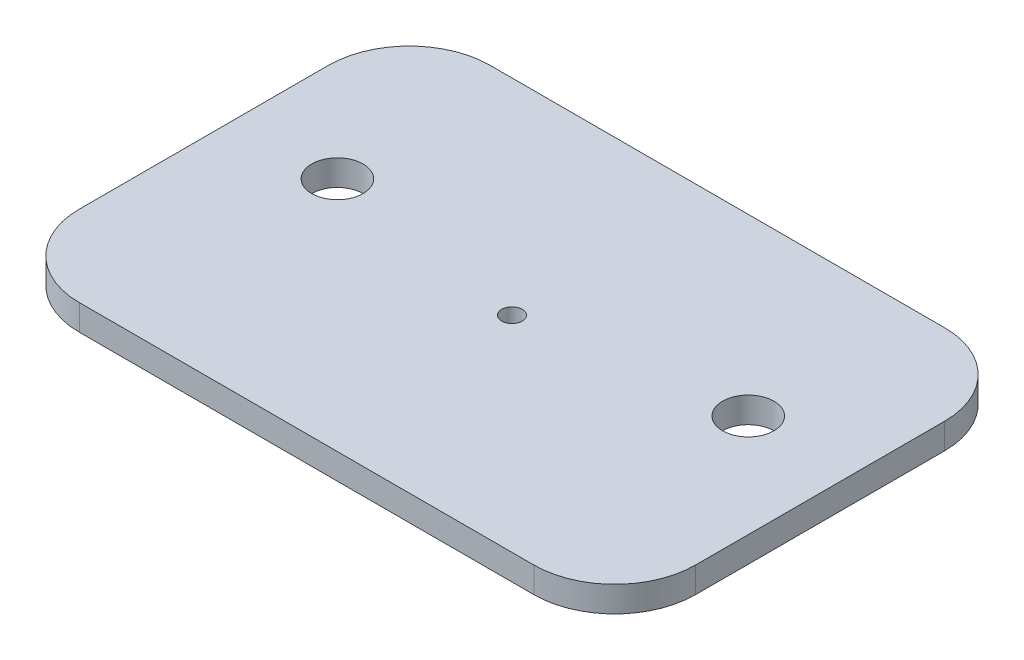
ISO-10303-21;
HEADER;
FILE_DESCRIPTION(('STEP AP214'),'2;1');
FILE_NAME('part.step','',(''),(''),'','','');
FILE_SCHEMA(('AUTOMOTIVE_DESIGN { 1 0 10303 214 1 1 1 1 }'));
ENDSEC;
DATA;
#1=APPLICATION_CONTEXT('core data for automotive mechanical design processes');
#2=APPLICATION_PROTOCOL_DEFINITION('international standard','automotive_design',2000,#1);
#3=PRODUCT_CONTEXT('',#1,'mechanical');
#4=PRODUCT('Part','Part','',(#3));
#5=PRODUCT_RELATED_PRODUCT_CATEGORY('part','',(#4));
#6=PRODUCT_DEFINITION_FORMATION('','',#4);
#7=PRODUCT_DEFINITION_CONTEXT('part definition',#1,'design');
#8=PRODUCT_DEFINITION('design','',#6,#7);
#9=PRODUCT_DEFINITION_SHAPE('','',#8);
#10=(LENGTH_UNIT() NAMED_UNIT(*) SI_UNIT(.MILLI.,.METRE.));
#11=(NAMED_UNIT(*) PLANE_ANGLE_UNIT() SI_UNIT($,.RADIAN.));
#12=(NAMED_UNIT(*) SI_UNIT($,.STERADIAN.) SOLID_ANGLE_UNIT());
#13=UNCERTAINTY_MEASURE_WITH_UNIT(LENGTH_MEASURE(1.E-05),#10,'distance_accuracy_value','');
#14=(GEOMETRIC_REPRESENTATION_CONTEXT(3) GLOBAL_UNCERTAINTY_ASSIGNED_CONTEXT((#13)) GLOBAL_UNIT_ASSIGNED_CONTEXT((#10,
#11,#12)) REPRESENTATION_CONTEXT('',''));
#15=CARTESIAN_POINT('',(0.,0.,0.));
#16=DIRECTION('',(0.,0.,1.));
#17=DIRECTION('',(1.,0.,0.));
#18=AXIS2_PLACEMENT_3D('',#15,#16,#17);
#19=CARTESIAN_POINT('',(0.,3.175,0.));
#20=DIRECTION('',(0.,-1.,0.));
#21=DIRECTION('',(0.,0.,-1.));
#22=AXIS2_PLACEMENT_3D('',#19,#20,#21);
#23=PLANE('',#22);
#24=DIRECTION('',(1.,0.,0.));
#25=VECTOR('',#24,1.);
#26=CARTESIAN_POINT('',(-38.1,3.175,25.4));
#27=LINE('',#26,#25);
#28=CARTESIAN_POINT('',(-28.1,3.175,25.4));
#29=VERTEX_POINT('',#28);
#30=CARTESIAN_POINT('',(28.1,3.175,25.4));
#31=VERTEX_POINT('',#30);
#32=EDGE_CURVE('E142',#29,#31,#27,.T.);
#33=ORIENTED_EDGE('',*,*,#32,.T.);
#34=CARTESIAN_POINT('',(28.1,3.175,15.4));
#35=DIRECTION('',(0.,-1.,0.));
#36=DIRECTION('',(0.,0.,-1.));
#37=AXIS2_PLACEMENT_3D('',#34,#35,#36);
#38=CIRCLE('',#37,10.);
#39=CARTESIAN_POINT('',(38.1,3.175,15.4));
#40=VERTEX_POINT('',#39);
#41=EDGE_CURVE('E161',#31,#40,#38,.F.);
#42=ORIENTED_EDGE('',*,*,#41,.T.);
#43=DIRECTION('',(0.,0.,-1.));
#44=VECTOR('',#43,1.);
#45=CARTESIAN_POINT('',(38.1,3.175,25.4));
#46=LINE('',#45,#44);
#47=CARTESIAN_POINT('',(38.1,3.175,-15.4));
#48=VERTEX_POINT('',#47);
#49=EDGE_CURVE('E125',#40,#48,#46,.T.);
#50=ORIENTED_EDGE('',*,*,#49,.T.);
#51=CARTESIAN_POINT('',(28.1,3.175,-15.4));
#52=DIRECTION('',(0.,-1.,0.));
#53=DIRECTION('',(0.,0.,-1.));
#54=AXIS2_PLACEMENT_3D('',#51,#52,#53);
#55=CIRCLE('',#54,10.);
#56=CARTESIAN_POINT('',(28.1,3.175,-25.4));
#57=VERTEX_POINT('',#56);
#58=EDGE_CURVE('E156',#48,#57,#55,.F.);
#59=ORIENTED_EDGE('',*,*,#58,.T.);
#60=DIRECTION('',(-1.,0.,0.));
#61=VECTOR('',#60,1.);
#62=CARTESIAN_POINT('',(-38.1,3.175,-25.4));
#63=LINE('',#62,#61);
#64=CARTESIAN_POINT('',(-28.1,3.175,-25.4));
#65=VERTEX_POINT('',#64);
#66=EDGE_CURVE('E172',#57,#65,#63,.T.);
#67=ORIENTED_EDGE('',*,*,#66,.T.);
#68=CARTESIAN_POINT('',(-28.1,3.175,-15.4));
#69=DIRECTION('',(0.,-1.,0.));
#70=DIRECTION('',(0.,0.,-1.));
#71=AXIS2_PLACEMENT_3D('',#68,#69,#70);
#72=CIRCLE('',#71,10.);
#73=CARTESIAN_POINT('',(-38.1,3.175,-15.4));
#74=VERTEX_POINT('',#73);
#75=EDGE_CURVE('E61',#65,#74,#72,.F.);
#76=ORIENTED_EDGE('',*,*,#75,.T.);
#77=DIRECTION('',(0.,0.,1.));
#78=VECTOR('',#77,1.);
#79=CARTESIAN_POINT('',(-38.1,3.175,25.4));
#80=LINE('',#79,#78);
#81=CARTESIAN_POINT('',(-38.1,3.175,15.4));
#82=VERTEX_POINT('',#81);
#83=EDGE_CURVE('E180',#74,#82,#80,.T.);
#84=ORIENTED_EDGE('',*,*,#83,.T.);
#85=CARTESIAN_POINT('',(-28.1,3.175,15.4));
#86=DIRECTION('',(0.,-1.,0.));
#87=DIRECTION('',(0.,0.,-1.));
#88=AXIS2_PLACEMENT_3D('',#85,#86,#87);
#89=CIRCLE('',#88,10.);
#90=EDGE_CURVE('E159',#82,#29,#89,.F.);
#91=ORIENTED_EDGE('',*,*,#90,.T.);
#92=EDGE_LOOP('',(#33,#42,#50,#59,#67,#76,#84,#91));
#93=FACE_BOUND('',#92,.T.);
#94=CARTESIAN_POINT('',(-25.4,3.175,-3.81));
#95=DIRECTION('',(0.,1.,0.));
#96=DIRECTION('',(0.,0.,1.));
#97=AXIS2_PLACEMENT_3D('',#94,#95,#96);
#98=CIRCLE('',#97,3.175);
#99=CARTESIAN_POINT('',(-25.4,3.175,-0.634999999999996));
#100=VERTEX_POINT('',#99);
#101=EDGE_CURVE('E133',#100,#100,#98,.T.);
#102=ORIENTED_EDGE('',*,*,#101,.F.);
#103=EDGE_LOOP('',(#102));
#104=FACE_BOUND('',#103,.T.);
#105=CARTESIAN_POINT('',(25.4,3.175,-3.81));
#106=DIRECTION('',(0.,1.,0.));
#107=DIRECTION('',(0.,0.,1.));
#108=AXIS2_PLACEMENT_3D('',#105,#106,#107);
#109=CIRCLE('',#108,3.175);
#110=CARTESIAN_POINT('',(25.4,3.175,-0.634999999999996));
#111=VERTEX_POINT('',#110);
#112=EDGE_CURVE('E187',#111,#111,#109,.T.);
#113=ORIENTED_EDGE('',*,*,#112,.F.);
#114=EDGE_LOOP('',(#113));
#115=FACE_BOUND('',#114,.T.);
#116=CARTESIAN_POINT('',(0.,3.175,0.));
#117=DIRECTION('',(0.,1.,0.));
#118=DIRECTION('',(0.,0.,1.));
#119=AXIS2_PLACEMENT_3D('',#116,#117,#118);
#120=CIRCLE('',#119,1.27);
#121=CARTESIAN_POINT('',(0.,3.175,1.27));
#122=VERTEX_POINT('',#121);
#123=EDGE_CURVE('E192',#122,#122,#120,.T.);
#124=ORIENTED_EDGE('',*,*,#123,.F.);
#125=EDGE_LOOP('',(#124));
#126=FACE_BOUND('',#125,.T.);
#127=ADVANCED_FACE('F39',(#93,#104,#115,#126),#23,.F.);
#128=CARTESIAN_POINT('',(0.,0.,0.));
#129=DIRECTION('',(0.,-1.,0.));
#130=DIRECTION('',(0.,0.,-1.));
#131=AXIS2_PLACEMENT_3D('',#128,#129,#130);
#132=PLANE('',#131);
#133=CARTESIAN_POINT('',(25.4,0.,-3.81));
#134=DIRECTION('',(0.,1.,0.));
#135=DIRECTION('',(0.,0.,1.));
#136=AXIS2_PLACEMENT_3D('',#133,#134,#135);
#137=CIRCLE('',#136,3.175);
#138=CARTESIAN_POINT('',(25.4,0.,-0.634999999999996));
#139=VERTEX_POINT('',#138);
#140=EDGE_CURVE('E189',#139,#139,#137,.T.);
#141=ORIENTED_EDGE('',*,*,#140,.T.);
#142=EDGE_LOOP('',(#141));
#143=FACE_BOUND('',#142,.T.);
#144=DIRECTION('',(0.,0.,-1.));
#145=VECTOR('',#144,1.);
#146=CARTESIAN_POINT('',(38.1,0.,25.4));
#147=LINE('',#146,#145);
#148=CARTESIAN_POINT('',(38.1,0.,15.4));
#149=VERTEX_POINT('',#148);
#150=CARTESIAN_POINT('',(38.1,0.,-15.4));
#151=VERTEX_POINT('',#150);
#152=EDGE_CURVE('E122',#149,#151,#147,.T.);
#153=ORIENTED_EDGE('',*,*,#152,.F.);
#154=CARTESIAN_POINT('',(28.1,0.,15.4));
#155=DIRECTION('',(0.,-1.,0.));
#156=DIRECTION('',(0.,0.,-1.));
#157=AXIS2_PLACEMENT_3D('',#154,#155,#156);
#158=CIRCLE('',#157,10.);
#159=CARTESIAN_POINT('',(28.1,0.,25.4));
#160=VERTEX_POINT('',#159);
#161=EDGE_CURVE('E105',#149,#160,#158,.T.);
#162=ORIENTED_EDGE('',*,*,#161,.T.);
#163=DIRECTION('',(1.,0.,0.));
#164=VECTOR('',#163,1.);
#165=CARTESIAN_POINT('',(-38.1,0.,25.4));
#166=LINE('',#165,#164);
#167=CARTESIAN_POINT('',(-28.1,0.,25.4));
#168=VERTEX_POINT('',#167);
#169=EDGE_CURVE('E146',#168,#160,#166,.T.);
#170=ORIENTED_EDGE('',*,*,#169,.F.);
#171=CARTESIAN_POINT('',(-28.1,0.,15.4));
#172=DIRECTION('',(0.,-1.,0.));
#173=DIRECTION('',(0.,0.,-1.));
#174=AXIS2_PLACEMENT_3D('',#171,#172,#173);
#175=CIRCLE('',#174,10.);
#176=CARTESIAN_POINT('',(-38.1,0.,15.4));
#177=VERTEX_POINT('',#176);
#178=EDGE_CURVE('E116',#168,#177,#175,.T.);
#179=ORIENTED_EDGE('',*,*,#178,.T.);
#180=DIRECTION('',(0.,0.,1.));
#181=VECTOR('',#180,1.);
#182=CARTESIAN_POINT('',(-38.1,0.,25.4));
#183=LINE('',#182,#181);
#184=CARTESIAN_POINT('',(-38.1,0.,-15.4));
#185=VERTEX_POINT('',#184);
#186=EDGE_CURVE('E136',#185,#177,#183,.T.);
#187=ORIENTED_EDGE('',*,*,#186,.F.);
#188=CARTESIAN_POINT('',(-28.1,0.,-15.4));
#189=DIRECTION('',(0.,-1.,0.));
#190=DIRECTION('',(0.,0.,-1.));
#191=AXIS2_PLACEMENT_3D('',#188,#189,#190);
#192=CIRCLE('',#191,10.);
#193=CARTESIAN_POINT('',(-28.1,0.,-25.4));
#194=VERTEX_POINT('',#193);
#195=EDGE_CURVE('E150',#185,#194,#192,.T.);
#196=ORIENTED_EDGE('',*,*,#195,.T.);
#197=DIRECTION('',(-1.,0.,0.));
#198=VECTOR('',#197,1.);
#199=CARTESIAN_POINT('',(-38.1,0.,-25.4));
#200=LINE('',#199,#198);
#201=CARTESIAN_POINT('',(28.1,0.,-25.4));
#202=VERTEX_POINT('',#201);
#203=EDGE_CURVE('E132',#202,#194,#200,.T.);
#204=ORIENTED_EDGE('',*,*,#203,.F.);
#205=CARTESIAN_POINT('',(28.1,0.,-15.4));
#206=DIRECTION('',(0.,-1.,0.));
#207=DIRECTION('',(0.,0.,-1.));
#208=AXIS2_PLACEMENT_3D('',#205,#206,#207);
#209=CIRCLE('',#208,10.);
#210=EDGE_CURVE('E126',#202,#151,#209,.T.);
#211=ORIENTED_EDGE('',*,*,#210,.T.);
#212=EDGE_LOOP('',(#153,#162,#170,#179,#187,#196,#204,#211));
#213=FACE_BOUND('',#212,.T.);
#214=CARTESIAN_POINT('',(-25.4,0.,-3.81));
#215=DIRECTION('',(0.,1.,0.));
#216=DIRECTION('',(0.,0.,1.));
#217=AXIS2_PLACEMENT_3D('',#214,#215,#216);
#218=CIRCLE('',#217,3.175);
#219=CARTESIAN_POINT('',(-25.4,0.,-0.634999999999996));
#220=VERTEX_POINT('',#219);
#221=EDGE_CURVE('E139',#220,#220,#218,.T.);
#222=ORIENTED_EDGE('',*,*,#221,.T.);
#223=EDGE_LOOP('',(#222));
#224=FACE_BOUND('',#223,.T.);
#225=CARTESIAN_POINT('',(0.,0.,0.));
#226=DIRECTION('',(0.,1.,0.));
#227=DIRECTION('',(0.,0.,1.));
#228=AXIS2_PLACEMENT_3D('',#225,#226,#227);
#229=CIRCLE('',#228,1.27);
#230=CARTESIAN_POINT('',(0.,0.,1.27));
#231=VERTEX_POINT('',#230);
#232=EDGE_CURVE('E195',#231,#231,#229,.T.);
#233=ORIENTED_EDGE('',*,*,#232,.T.);
#234=EDGE_LOOP('',(#233));
#235=FACE_BOUND('',#234,.T.);
#236=ADVANCED_FACE('F129',(#143,#213,#224,#235),#132,.T.);
#237=CARTESIAN_POINT('',(38.1,3.175,25.4));
#238=DIRECTION('',(-1.,0.,0.));
#239=DIRECTION('',(0.,0.,1.));
#240=AXIS2_PLACEMENT_3D('',#237,#238,#239);
#241=PLANE('',#240);
#242=ORIENTED_EDGE('',*,*,#49,.F.);
#243=DIRECTION('',(0.,-1.,0.));
#244=VECTOR('',#243,1.);
#245=CARTESIAN_POINT('',(38.1,3.175,15.4));
#246=LINE('',#245,#244);
#247=EDGE_CURVE('E109',#40,#149,#246,.T.);
#248=ORIENTED_EDGE('',*,*,#247,.T.);
#249=ORIENTED_EDGE('',*,*,#152,.T.);
#250=DIRECTION('',(0.,-1.,0.));
#251=VECTOR('',#250,1.);
#252=CARTESIAN_POINT('',(38.1,3.175,-15.4));
#253=LINE('',#252,#251);
#254=EDGE_CURVE('E127',#151,#48,#253,.F.);
#255=ORIENTED_EDGE('',*,*,#254,.T.);
#256=EDGE_LOOP('',(#242,#248,#249,#255));
#257=FACE_BOUND('',#256,.T.);
#258=ADVANCED_FACE('F121',(#257),#241,.F.);
#259=CARTESIAN_POINT('',(-38.1,3.175,-25.4));
#260=DIRECTION('',(0.,0.,1.));
#261=DIRECTION('',(1.,0.,0.));
#262=AXIS2_PLACEMENT_3D('',#259,#260,#261);
#263=PLANE('',#262);
#264=ORIENTED_EDGE('',*,*,#203,.T.);
#265=DIRECTION('',(0.,-1.,0.));
#266=VECTOR('',#265,1.);
#267=CARTESIAN_POINT('',(-28.1,3.175,-25.4));
#268=LINE('',#267,#266);
#269=EDGE_CURVE('E11',#194,#65,#268,.F.);
#270=ORIENTED_EDGE('',*,*,#269,.T.);
#271=ORIENTED_EDGE('',*,*,#66,.F.);
#272=DIRECTION('',(0.,-1.,0.));
#273=VECTOR('',#272,1.);
#274=CARTESIAN_POINT('',(28.1,3.175,-25.4));
#275=LINE('',#274,#273);
#276=EDGE_CURVE('E47',#57,#202,#275,.T.);
#277=ORIENTED_EDGE('',*,*,#276,.T.);
#278=EDGE_LOOP('',(#264,#270,#271,#277));
#279=FACE_BOUND('',#278,.T.);
#280=ADVANCED_FACE('F170',(#279),#263,.F.);
#281=CARTESIAN_POINT('',(-38.1,3.175,25.4));
#282=DIRECTION('',(1.,0.,0.));
#283=DIRECTION('',(0.,0.,-1.));
#284=AXIS2_PLACEMENT_3D('',#281,#282,#283);
#285=PLANE('',#284);
#286=ORIENTED_EDGE('',*,*,#186,.T.);
#287=DIRECTION('',(0.,-1.,0.));
#288=VECTOR('',#287,1.);
#289=CARTESIAN_POINT('',(-38.1,3.175,15.4));
#290=LINE('',#289,#288);
#291=EDGE_CURVE('E54',#177,#82,#290,.F.);
#292=ORIENTED_EDGE('',*,*,#291,.T.);
#293=ORIENTED_EDGE('',*,*,#83,.F.);
#294=DIRECTION('',(0.,-1.,0.));
#295=VECTOR('',#294,1.);
#296=CARTESIAN_POINT('',(-38.1,3.175,-15.4));
#297=LINE('',#296,#295);
#298=EDGE_CURVE('E163',#74,#185,#297,.T.);
#299=ORIENTED_EDGE('',*,*,#298,.T.);
#300=EDGE_LOOP('',(#286,#292,#293,#299));
#301=FACE_BOUND('',#300,.T.);
#302=ADVANCED_FACE('F179',(#301),#285,.F.);
#303=CARTESIAN_POINT('',(-38.1,3.175,25.4));
#304=DIRECTION('',(0.,0.,-1.));
#305=DIRECTION('',(-1.,0.,0.));
#306=AXIS2_PLACEMENT_3D('',#303,#304,#305);
#307=PLANE('',#306);
#308=ORIENTED_EDGE('',*,*,#169,.T.);
#309=DIRECTION('',(0.,-1.,0.));
#310=VECTOR('',#309,1.);
#311=CARTESIAN_POINT('',(28.1,3.175,25.4));
#312=LINE('',#311,#310);
#313=EDGE_CURVE('E110',#160,#31,#312,.F.);
#314=ORIENTED_EDGE('',*,*,#313,.T.);
#315=ORIENTED_EDGE('',*,*,#32,.F.);
#316=DIRECTION('',(0.,-1.,0.));
#317=VECTOR('',#316,1.);
#318=CARTESIAN_POINT('',(-28.1,3.175,25.4));
#319=LINE('',#318,#317);
#320=EDGE_CURVE('E115',#29,#168,#319,.T.);
#321=ORIENTED_EDGE('',*,*,#320,.T.);
#322=EDGE_LOOP('',(#308,#314,#315,#321));
#323=FACE_BOUND('',#322,.T.);
#324=ADVANCED_FACE('F217',(#323),#307,.F.);
#325=CARTESIAN_POINT('',(-25.4,3.175,-3.81));
#326=DIRECTION('',(0.,-1.,0.));
#327=DIRECTION('',(0.,0.,-1.));
#328=AXIS2_PLACEMENT_3D('',#325,#326,#327);
#329=CYLINDRICAL_SURFACE('',#328,3.175);
#330=ORIENTED_EDGE('',*,*,#101,.T.);
#331=EDGE_LOOP('',(#330));
#332=FACE_BOUND('',#331,.T.);
#333=ORIENTED_EDGE('',*,*,#221,.F.);
#334=EDGE_LOOP('',(#333));
#335=FACE_BOUND('',#334,.T.);
#336=ADVANCED_FACE('F214',(#332,#335),#329,.F.);
#337=CARTESIAN_POINT('',(25.4,3.175,-3.81));
#338=DIRECTION('',(0.,-1.,0.));
#339=DIRECTION('',(0.,0.,-1.));
#340=AXIS2_PLACEMENT_3D('',#337,#338,#339);
#341=CYLINDRICAL_SURFACE('',#340,3.175);
#342=ORIENTED_EDGE('',*,*,#112,.T.);
#343=EDGE_LOOP('',(#342));
#344=FACE_BOUND('',#343,.T.);
#345=ORIENTED_EDGE('',*,*,#140,.F.);
#346=EDGE_LOOP('',(#345));
#347=FACE_BOUND('',#346,.T.);
#348=ADVANCED_FACE('F317',(#344,#347),#341,.F.);
#349=CARTESIAN_POINT('',(0.,3.175,0.));
#350=DIRECTION('',(0.,-1.,0.));
#351=DIRECTION('',(0.,0.,-1.));
#352=AXIS2_PLACEMENT_3D('',#349,#350,#351);
#353=CYLINDRICAL_SURFACE('',#352,1.27);
#354=ORIENTED_EDGE('',*,*,#123,.T.);
#355=EDGE_LOOP('',(#354));
#356=FACE_BOUND('',#355,.T.);
#357=ORIENTED_EDGE('',*,*,#232,.F.);
#358=EDGE_LOOP('',(#357));
#359=FACE_BOUND('',#358,.T.);
#360=ADVANCED_FACE('F201',(#356,#359),#353,.F.);
#361=CARTESIAN_POINT('',(28.1,3.175,15.4));
#362=DIRECTION('',(0.,-1.,0.));
#363=DIRECTION('',(0.,0.,-1.));
#364=AXIS2_PLACEMENT_3D('',#361,#362,#363);
#365=CYLINDRICAL_SURFACE('',#364,10.);
#366=ORIENTED_EDGE('',*,*,#41,.F.);
#367=ORIENTED_EDGE('',*,*,#313,.F.);
#368=ORIENTED_EDGE('',*,*,#161,.F.);
#369=ORIENTED_EDGE('',*,*,#247,.F.);
#370=EDGE_LOOP('',(#366,#367,#368,#369));
#371=FACE_BOUND('',#370,.T.);
#372=ADVANCED_FACE('F108',(#371),#365,.T.);
#373=CARTESIAN_POINT('',(-28.1,3.175,15.4));
#374=DIRECTION('',(0.,-1.,0.));
#375=DIRECTION('',(0.,0.,-1.));
#376=AXIS2_PLACEMENT_3D('',#373,#374,#375);
#377=CYLINDRICAL_SURFACE('',#376,10.);
#378=ORIENTED_EDGE('',*,*,#90,.F.);
#379=ORIENTED_EDGE('',*,*,#291,.F.);
#380=ORIENTED_EDGE('',*,*,#178,.F.);
#381=ORIENTED_EDGE('',*,*,#320,.F.);
#382=EDGE_LOOP('',(#378,#379,#380,#381));
#383=FACE_BOUND('',#382,.T.);
#384=ADVANCED_FACE('F229',(#383),#377,.T.);
#385=CARTESIAN_POINT('',(-28.1,3.175,-15.4));
#386=DIRECTION('',(0.,-1.,0.));
#387=DIRECTION('',(0.,0.,-1.));
#388=AXIS2_PLACEMENT_3D('',#385,#386,#387);
#389=CYLINDRICAL_SURFACE('',#388,10.);
#390=ORIENTED_EDGE('',*,*,#75,.F.);
#391=ORIENTED_EDGE('',*,*,#269,.F.);
#392=ORIENTED_EDGE('',*,*,#195,.F.);
#393=ORIENTED_EDGE('',*,*,#298,.F.);
#394=EDGE_LOOP('',(#390,#391,#392,#393));
#395=FACE_BOUND('',#394,.T.);
#396=ADVANCED_FACE('F178',(#395),#389,.T.);
#397=CARTESIAN_POINT('',(28.1,3.175,-15.4));
#398=DIRECTION('',(0.,-1.,0.));
#399=DIRECTION('',(0.,0.,-1.));
#400=AXIS2_PLACEMENT_3D('',#397,#398,#399);
#401=CYLINDRICAL_SURFACE('',#400,10.);
#402=ORIENTED_EDGE('',*,*,#58,.F.);
#403=ORIENTED_EDGE('',*,*,#254,.F.);
#404=ORIENTED_EDGE('',*,*,#210,.F.);
#405=ORIENTED_EDGE('',*,*,#276,.F.);
#406=EDGE_LOOP('',(#402,#403,#404,#405));
#407=FACE_BOUND('',#406,.T.);
#408=ADVANCED_FACE('F41',(#407),#401,.T.);
#409=CLOSED_SHELL('',(#127,#236,#258,#280,#302,#324,#336,#348,#360,#372,#384,#396,#408));
#410=MANIFOLD_SOLID_BREP('B2',#409);
#411=ADVANCED_BREP_SHAPE_REPRESENTATION('',(#18,#410),#14);
#412=SHAPE_DEFINITION_REPRESENTATION(#9,#411);
ENDSEC;
END-ISO-10303-21;
